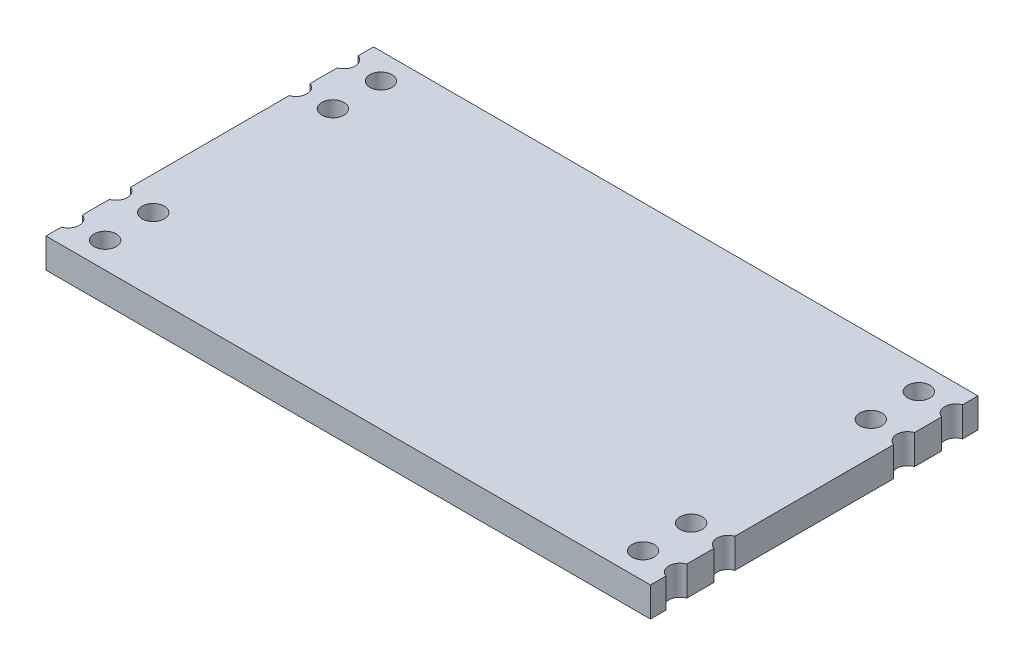
ISO-10303-21;
HEADER;
FILE_DESCRIPTION(('STEP AP214'),'2;1');
FILE_NAME('part.step','',(''),(''),'','','');
FILE_SCHEMA(('AUTOMOTIVE_DESIGN { 1 0 10303 214 1 1 1 1 }'));
ENDSEC;
DATA;
#1=APPLICATION_CONTEXT('core data for automotive mechanical design processes');
#2=APPLICATION_PROTOCOL_DEFINITION('international standard','automotive_design',2000,#1);
#3=PRODUCT_CONTEXT('',#1,'mechanical');
#4=PRODUCT('Part','Part','',(#3));
#5=PRODUCT_RELATED_PRODUCT_CATEGORY('part','',(#4));
#6=PRODUCT_DEFINITION_FORMATION('','',#4);
#7=PRODUCT_DEFINITION_CONTEXT('part definition',#1,'design');
#8=PRODUCT_DEFINITION('design','',#6,#7);
#9=PRODUCT_DEFINITION_SHAPE('','',#8);
#10=(LENGTH_UNIT() NAMED_UNIT(*) SI_UNIT(.MILLI.,.METRE.));
#11=(NAMED_UNIT(*) PLANE_ANGLE_UNIT() SI_UNIT($,.RADIAN.));
#12=(NAMED_UNIT(*) SI_UNIT($,.STERADIAN.) SOLID_ANGLE_UNIT());
#13=UNCERTAINTY_MEASURE_WITH_UNIT(LENGTH_MEASURE(1.E-05),#10,'distance_accuracy_value','');
#14=(GEOMETRIC_REPRESENTATION_CONTEXT(3) GLOBAL_UNCERTAINTY_ASSIGNED_CONTEXT((#13)) GLOBAL_UNIT_ASSIGNED_CONTEXT((#10,
#11,#12)) REPRESENTATION_CONTEXT('',''));
#15=CARTESIAN_POINT('',(0.,0.,0.));
#16=DIRECTION('',(0.,0.,1.));
#17=DIRECTION('',(1.,0.,0.));
#18=AXIS2_PLACEMENT_3D('',#15,#16,#17);
#19=CARTESIAN_POINT('',(16.35,1.6,-8.86));
#20=DIRECTION('',(-1.,0.,0.));
#21=DIRECTION('',(0.,0.,1.));
#22=AXIS2_PLACEMENT_3D('',#19,#20,#21);
#23=PLANE('',#22);
#24=DIRECTION('',(0.,0.,-1.));
#25=VECTOR('',#24,1.);
#26=CARTESIAN_POINT('',(16.35,0.,-8.86));
#27=LINE('',#26,#25);
#28=CARTESIAN_POINT('',(16.35,0.,8.86));
#29=VERTEX_POINT('',#28);
#30=CARTESIAN_POINT('',(16.35,0.,8.02568542494924));
#31=VERTEX_POINT('',#30);
#32=EDGE_CURVE('E206',#29,#31,#27,.T.);
#33=ORIENTED_EDGE('',*,*,#32,.T.);
#34=DIRECTION('',(0.,1.,0.));
#35=VECTOR('',#34,1.);
#36=CARTESIAN_POINT('',(16.35,0.,8.02568542494924));
#37=LINE('',#36,#35);
#38=CARTESIAN_POINT('',(16.35,1.6,8.02568542494924));
#39=VERTEX_POINT('',#38);
#40=EDGE_CURVE('E66',#31,#39,#37,.T.);
#41=ORIENTED_EDGE('',*,*,#40,.T.);
#42=DIRECTION('',(0.,0.,-1.));
#43=VECTOR('',#42,1.);
#44=CARTESIAN_POINT('',(16.35,1.6,-8.86));
#45=LINE('',#44,#43);
#46=CARTESIAN_POINT('',(16.35,1.6,8.86));
#47=VERTEX_POINT('',#46);
#48=EDGE_CURVE('E285',#47,#39,#45,.T.);
#49=ORIENTED_EDGE('',*,*,#48,.F.);
#50=DIRECTION('',(0.,-1.,0.));
#51=VECTOR('',#50,1.);
#52=CARTESIAN_POINT('',(16.35,1.6,8.86));
#53=LINE('',#52,#51);
#54=EDGE_CURVE('E230',#47,#29,#53,.T.);
#55=ORIENTED_EDGE('',*,*,#54,.T.);
#56=EDGE_LOOP('',(#33,#41,#49,#55));
#57=FACE_BOUND('',#56,.T.);
#58=ADVANCED_FACE('F43',(#57),#23,.F.);
#59=CARTESIAN_POINT('',(16.35,1.6,6.89431457505077));
#60=VERTEX_POINT('',#59);
#61=CARTESIAN_POINT('',(16.35,1.6,5.42568542494924));
#62=VERTEX_POINT('',#61);
#63=EDGE_CURVE('E289',#60,#62,#45,.T.);
#64=ORIENTED_EDGE('',*,*,#63,.F.);
#65=DIRECTION('',(0.,1.,0.));
#66=VECTOR('',#65,1.);
#67=CARTESIAN_POINT('',(16.35,0.,6.89431457505077));
#68=LINE('',#67,#66);
#69=CARTESIAN_POINT('',(16.35,0.,6.89431457505077));
#70=VERTEX_POINT('',#69);
#71=EDGE_CURVE('E308',#60,#70,#68,.F.);
#72=ORIENTED_EDGE('',*,*,#71,.T.);
#73=CARTESIAN_POINT('',(16.35,0.,5.42568542494924));
#74=VERTEX_POINT('',#73);
#75=EDGE_CURVE('E203',#70,#74,#27,.T.);
#76=ORIENTED_EDGE('',*,*,#75,.T.);
#77=DIRECTION('',(0.,1.,0.));
#78=VECTOR('',#77,1.);
#79=CARTESIAN_POINT('',(16.35,0.,5.42568542494924));
#80=LINE('',#79,#78);
#81=EDGE_CURVE('E58',#74,#62,#80,.T.);
#82=ORIENTED_EDGE('',*,*,#81,.T.);
#83=EDGE_LOOP('',(#64,#72,#76,#82));
#84=FACE_BOUND('',#83,.T.);
#85=ADVANCED_FACE('F400',(#84),#23,.F.);
#86=CARTESIAN_POINT('',(-16.35,1.6,-8.86));
#87=DIRECTION('',(1.,0.,0.));
#88=DIRECTION('',(0.,0.,-1.));
#89=AXIS2_PLACEMENT_3D('',#86,#87,#88);
#90=PLANE('',#89);
#91=DIRECTION('',(0.,1.,0.));
#92=VECTOR('',#91,1.);
#93=CARTESIAN_POINT('',(-16.35,0.,6.89431457505077));
#94=LINE('',#93,#92);
#95=CARTESIAN_POINT('',(-16.35,1.6,6.89431457505077));
#96=VERTEX_POINT('',#95);
#97=CARTESIAN_POINT('',(-16.35,0.,6.89431457505077));
#98=VERTEX_POINT('',#97);
#99=EDGE_CURVE('E340',#96,#98,#94,.F.);
#100=ORIENTED_EDGE('',*,*,#99,.F.);
#101=DIRECTION('',(0.,0.,1.));
#102=VECTOR('',#101,1.);
#103=CARTESIAN_POINT('',(-16.35,1.6,-8.86));
#104=LINE('',#103,#102);
#105=CARTESIAN_POINT('',(-16.35,1.6,5.42568542494924));
#106=VERTEX_POINT('',#105);
#107=EDGE_CURVE('E479',#106,#96,#104,.T.);
#108=ORIENTED_EDGE('',*,*,#107,.F.);
#109=DIRECTION('',(0.,1.,0.));
#110=VECTOR('',#109,1.);
#111=CARTESIAN_POINT('',(-16.35,0.,5.42568542494924));
#112=LINE('',#111,#110);
#113=CARTESIAN_POINT('',(-16.35,0.,5.42568542494924));
#114=VERTEX_POINT('',#113);
#115=EDGE_CURVE('E328',#114,#106,#112,.T.);
#116=ORIENTED_EDGE('',*,*,#115,.F.);
#117=DIRECTION('',(0.,0.,1.));
#118=VECTOR('',#117,1.);
#119=CARTESIAN_POINT('',(-16.35,0.,-8.86));
#120=LINE('',#119,#118);
#121=EDGE_CURVE('E221',#114,#98,#120,.T.);
#122=ORIENTED_EDGE('',*,*,#121,.T.);
#123=EDGE_LOOP('',(#100,#108,#116,#122));
#124=FACE_BOUND('',#123,.T.);
#125=ADVANCED_FACE('F405',(#124),#90,.F.);
#126=DIRECTION('',(0.,1.,0.));
#127=VECTOR('',#126,1.);
#128=CARTESIAN_POINT('',(-16.35,0.,8.02568542494924));
#129=LINE('',#128,#127);
#130=CARTESIAN_POINT('',(-16.35,0.,8.02568542494924));
#131=VERTEX_POINT('',#130);
#132=CARTESIAN_POINT('',(-16.35,1.6,8.02568542494924));
#133=VERTEX_POINT('',#132);
#134=EDGE_CURVE('E338',#131,#133,#129,.T.);
#135=ORIENTED_EDGE('',*,*,#134,.F.);
#136=CARTESIAN_POINT('',(-16.35,0.,8.86));
#137=VERTEX_POINT('',#136);
#138=EDGE_CURVE('E216',#131,#137,#120,.T.);
#139=ORIENTED_EDGE('',*,*,#138,.T.);
#140=DIRECTION('',(0.,-1.,0.));
#141=VECTOR('',#140,1.);
#142=CARTESIAN_POINT('',(-16.35,1.6,8.86));
#143=LINE('',#142,#141);
#144=CARTESIAN_POINT('',(-16.35,1.6,8.86));
#145=VERTEX_POINT('',#144);
#146=EDGE_CURVE('E232',#145,#137,#143,.T.);
#147=ORIENTED_EDGE('',*,*,#146,.F.);
#148=EDGE_CURVE('E292',#133,#145,#104,.T.);
#149=ORIENTED_EDGE('',*,*,#148,.F.);
#150=EDGE_LOOP('',(#135,#139,#147,#149));
#151=FACE_BOUND('',#150,.T.);
#152=ADVANCED_FACE('F415',(#151),#90,.F.);
#153=DIRECTION('',(0.,1.,0.));
#154=VECTOR('',#153,1.);
#155=CARTESIAN_POINT('',(-16.35,0.,4.29431457505077));
#156=LINE('',#155,#154);
#157=CARTESIAN_POINT('',(-16.35,1.6,4.29431457505077));
#158=VERTEX_POINT('',#157);
#159=CARTESIAN_POINT('',(-16.35,0.,4.29431457505077));
#160=VERTEX_POINT('',#159);
#161=EDGE_CURVE('E336',#158,#160,#156,.F.);
#162=ORIENTED_EDGE('',*,*,#161,.F.);
#163=CARTESIAN_POINT('',(-16.35,1.6,-4.29431457505076));
#164=VERTEX_POINT('',#163);
#165=EDGE_CURVE('E465',#164,#158,#104,.T.);
#166=ORIENTED_EDGE('',*,*,#165,.F.);
#167=DIRECTION('',(0.,1.,0.));
#168=VECTOR('',#167,1.);
#169=CARTESIAN_POINT('',(-16.35,0.,-4.29431457505076));
#170=LINE('',#169,#168);
#171=CARTESIAN_POINT('',(-16.35,0.,-4.29431457505076));
#172=VERTEX_POINT('',#171);
#173=EDGE_CURVE('E251',#164,#172,#170,.F.);
#174=ORIENTED_EDGE('',*,*,#173,.T.);
#175=EDGE_CURVE('E463',#172,#160,#120,.T.);
#176=ORIENTED_EDGE('',*,*,#175,.T.);
#177=EDGE_LOOP('',(#162,#166,#174,#176));
#178=FACE_BOUND('',#177,.T.);
#179=ADVANCED_FACE('F409',(#178),#90,.F.);
#180=DIRECTION('',(0.,1.,0.));
#181=VECTOR('',#180,1.);
#182=CARTESIAN_POINT('',(16.35,0.,-6.89431457505077));
#183=LINE('',#182,#181);
#184=CARTESIAN_POINT('',(16.35,1.6,-6.89431457505077));
#185=VERTEX_POINT('',#184);
#186=CARTESIAN_POINT('',(16.35,0.,-6.89431457505077));
#187=VERTEX_POINT('',#186);
#188=EDGE_CURVE('E369',#185,#187,#183,.F.);
#189=ORIENTED_EDGE('',*,*,#188,.F.);
#190=CARTESIAN_POINT('',(16.35,1.6,-5.42568542494924));
#191=VERTEX_POINT('',#190);
#192=EDGE_CURVE('E290',#191,#185,#45,.T.);
#193=ORIENTED_EDGE('',*,*,#192,.F.);
#194=DIRECTION('',(0.,1.,0.));
#195=VECTOR('',#194,1.);
#196=CARTESIAN_POINT('',(16.35,0.,-5.42568542494924));
#197=LINE('',#196,#195);
#198=CARTESIAN_POINT('',(16.35,0.,-5.42568542494924));
#199=VERTEX_POINT('',#198);
#200=EDGE_CURVE('E357',#199,#191,#197,.T.);
#201=ORIENTED_EDGE('',*,*,#200,.F.);
#202=EDGE_CURVE('E204',#199,#187,#27,.T.);
#203=ORIENTED_EDGE('',*,*,#202,.T.);
#204=EDGE_LOOP('',(#189,#193,#201,#203));
#205=FACE_BOUND('',#204,.T.);
#206=ADVANCED_FACE('F45',(#205),#23,.F.);
#207=DIRECTION('',(0.,1.,0.));
#208=VECTOR('',#207,1.);
#209=CARTESIAN_POINT('',(16.35,0.,-8.02568542494924));
#210=LINE('',#209,#208);
#211=CARTESIAN_POINT('',(16.35,0.,-8.02568542494924));
#212=VERTEX_POINT('',#211);
#213=CARTESIAN_POINT('',(16.35,1.6,-8.02568542494924));
#214=VERTEX_POINT('',#213);
#215=EDGE_CURVE('E367',#212,#214,#210,.T.);
#216=ORIENTED_EDGE('',*,*,#215,.F.);
#217=CARTESIAN_POINT('',(16.35,0.,-8.86));
#218=VERTEX_POINT('',#217);
#219=EDGE_CURVE('E207',#212,#218,#27,.T.);
#220=ORIENTED_EDGE('',*,*,#219,.T.);
#221=DIRECTION('',(0.,-1.,0.));
#222=VECTOR('',#221,1.);
#223=CARTESIAN_POINT('',(16.35,1.6,-8.86));
#224=LINE('',#223,#222);
#225=CARTESIAN_POINT('',(16.35,1.6,-8.86));
#226=VERTEX_POINT('',#225);
#227=EDGE_CURVE('E11',#226,#218,#224,.T.);
#228=ORIENTED_EDGE('',*,*,#227,.F.);
#229=EDGE_CURVE('E229',#214,#226,#45,.T.);
#230=ORIENTED_EDGE('',*,*,#229,.F.);
#231=EDGE_LOOP('',(#216,#220,#228,#230));
#232=FACE_BOUND('',#231,.T.);
#233=ADVANCED_FACE('F407',(#232),#23,.F.);
#234=CARTESIAN_POINT('',(16.35,1.6,4.29431457505077));
#235=VERTEX_POINT('',#234);
#236=CARTESIAN_POINT('',(16.35,1.6,-4.29431457505077));
#237=VERTEX_POINT('',#236);
#238=EDGE_CURVE('E195',#235,#237,#45,.T.);
#239=ORIENTED_EDGE('',*,*,#238,.F.);
#240=DIRECTION('',(0.,1.,0.));
#241=VECTOR('',#240,1.);
#242=CARTESIAN_POINT('',(16.35,0.,4.29431457505077));
#243=LINE('',#242,#241);
#244=CARTESIAN_POINT('',(16.35,0.,4.29431457505077));
#245=VERTEX_POINT('',#244);
#246=EDGE_CURVE('E180',#235,#245,#243,.F.);
#247=ORIENTED_EDGE('',*,*,#246,.T.);
#248=CARTESIAN_POINT('',(16.35,0.,-4.29431457505077));
#249=VERTEX_POINT('',#248);
#250=EDGE_CURVE('E193',#245,#249,#27,.T.);
#251=ORIENTED_EDGE('',*,*,#250,.T.);
#252=DIRECTION('',(0.,1.,0.));
#253=VECTOR('',#252,1.);
#254=CARTESIAN_POINT('',(16.35,0.,-4.29431457505077));
#255=LINE('',#254,#253);
#256=EDGE_CURVE('E365',#237,#249,#255,.F.);
#257=ORIENTED_EDGE('',*,*,#256,.F.);
#258=EDGE_LOOP('',(#239,#247,#251,#257));
#259=FACE_BOUND('',#258,.T.);
#260=ADVANCED_FACE('F191',(#259),#23,.F.);
#261=CARTESIAN_POINT('',(-16.35,0.,-8.86));
#262=VERTEX_POINT('',#261);
#263=CARTESIAN_POINT('',(-16.35,0.,-8.02568542494924));
#264=VERTEX_POINT('',#263);
#265=EDGE_CURVE('E223',#262,#264,#120,.T.);
#266=ORIENTED_EDGE('',*,*,#265,.T.);
#267=DIRECTION('',(0.,1.,0.));
#268=VECTOR('',#267,1.);
#269=CARTESIAN_POINT('',(-16.35,0.,-8.02568542494924));
#270=LINE('',#269,#268);
#271=CARTESIAN_POINT('',(-16.35,1.6,-8.02568542494924));
#272=VERTEX_POINT('',#271);
#273=EDGE_CURVE('E271',#264,#272,#270,.T.);
#274=ORIENTED_EDGE('',*,*,#273,.T.);
#275=CARTESIAN_POINT('',(-16.35,1.6,-8.86));
#276=VERTEX_POINT('',#275);
#277=EDGE_CURVE('E241',#276,#272,#104,.T.);
#278=ORIENTED_EDGE('',*,*,#277,.F.);
#279=DIRECTION('',(0.,-1.,0.));
#280=VECTOR('',#279,1.);
#281=CARTESIAN_POINT('',(-16.35,1.6,-8.86));
#282=LINE('',#281,#280);
#283=EDGE_CURVE('E51',#276,#262,#282,.T.);
#284=ORIENTED_EDGE('',*,*,#283,.T.);
#285=EDGE_LOOP('',(#266,#274,#278,#284));
#286=FACE_BOUND('',#285,.T.);
#287=ADVANCED_FACE('F238',(#286),#90,.F.);
#288=CARTESIAN_POINT('',(-16.35,1.6,-6.89431457505076));
#289=VERTEX_POINT('',#288);
#290=CARTESIAN_POINT('',(-16.35,1.6,-5.42568542494924));
#291=VERTEX_POINT('',#290);
#292=EDGE_CURVE('E293',#289,#291,#104,.T.);
#293=ORIENTED_EDGE('',*,*,#292,.F.);
#294=DIRECTION('',(0.,1.,0.));
#295=VECTOR('',#294,1.);
#296=CARTESIAN_POINT('',(-16.35,0.,-6.89431457505076));
#297=LINE('',#296,#295);
#298=CARTESIAN_POINT('',(-16.35,0.,-6.89431457505076));
#299=VERTEX_POINT('',#298);
#300=EDGE_CURVE('E269',#289,#299,#297,.F.);
#301=ORIENTED_EDGE('',*,*,#300,.T.);
#302=CARTESIAN_POINT('',(-16.35,0.,-5.42568542494924));
#303=VERTEX_POINT('',#302);
#304=EDGE_CURVE('E227',#299,#303,#120,.T.);
#305=ORIENTED_EDGE('',*,*,#304,.T.);
#306=DIRECTION('',(0.,1.,0.));
#307=VECTOR('',#306,1.);
#308=CARTESIAN_POINT('',(-16.35,0.,-5.42568542494924));
#309=LINE('',#308,#307);
#310=EDGE_CURVE('E255',#303,#291,#309,.T.);
#311=ORIENTED_EDGE('',*,*,#310,.T.);
#312=EDGE_LOOP('',(#293,#301,#305,#311));
#313=FACE_BOUND('',#312,.T.);
#314=ADVANCED_FACE('F424',(#313),#90,.F.);
#315=CARTESIAN_POINT('',(-16.35,1.6,-8.86));
#316=DIRECTION('',(0.,0.,1.));
#317=DIRECTION('',(1.,0.,0.));
#318=AXIS2_PLACEMENT_3D('',#315,#316,#317);
#319=PLANE('',#318);
#320=DIRECTION('',(-1.,0.,0.));
#321=VECTOR('',#320,1.);
#322=CARTESIAN_POINT('',(-16.35,0.,-8.86));
#323=LINE('',#322,#321);
#324=EDGE_CURVE('E212',#218,#262,#323,.T.);
#325=ORIENTED_EDGE('',*,*,#324,.T.);
#326=ORIENTED_EDGE('',*,*,#283,.F.);
#327=DIRECTION('',(-1.,0.,0.));
#328=VECTOR('',#327,1.);
#329=CARTESIAN_POINT('',(-16.35,1.6,-8.86));
#330=LINE('',#329,#328);
#331=EDGE_CURVE('E288',#226,#276,#330,.T.);
#332=ORIENTED_EDGE('',*,*,#331,.F.);
#333=ORIENTED_EDGE('',*,*,#227,.T.);
#334=EDGE_LOOP('',(#325,#326,#332,#333));
#335=FACE_BOUND('',#334,.T.);
#336=ADVANCED_FACE('F429',(#335),#319,.F.);
#337=CARTESIAN_POINT('',(-16.35,1.6,8.86));
#338=DIRECTION('',(0.,0.,-1.));
#339=DIRECTION('',(-1.,0.,0.));
#340=AXIS2_PLACEMENT_3D('',#337,#338,#339);
#341=PLANE('',#340);
#342=DIRECTION('',(1.,0.,0.));
#343=VECTOR('',#342,1.);
#344=CARTESIAN_POINT('',(-16.35,0.,8.86));
#345=LINE('',#344,#343);
#346=EDGE_CURVE('E226',#137,#29,#345,.T.);
#347=ORIENTED_EDGE('',*,*,#346,.T.);
#348=ORIENTED_EDGE('',*,*,#54,.F.);
#349=DIRECTION('',(1.,0.,0.));
#350=VECTOR('',#349,1.);
#351=CARTESIAN_POINT('',(-16.35,1.6,8.86));
#352=LINE('',#351,#350);
#353=EDGE_CURVE('E233',#145,#47,#352,.T.);
#354=ORIENTED_EDGE('',*,*,#353,.F.);
#355=ORIENTED_EDGE('',*,*,#146,.T.);
#356=EDGE_LOOP('',(#347,#348,#354,#355));
#357=FACE_BOUND('',#356,.T.);
#358=ADVANCED_FACE('F305',(#357),#341,.F.);
#359=CARTESIAN_POINT('',(0.,1.6,0.));
#360=DIRECTION('',(0.,1.,0.));
#361=DIRECTION('',(0.,0.,1.));
#362=AXIS2_PLACEMENT_3D('',#359,#360,#361);
#363=PLANE('',#362);
#364=CARTESIAN_POINT('',(16.55,1.6,7.46));
#365=DIRECTION('',(0.,1.,0.));
#366=DIRECTION('',(0.,0.,-1.));
#367=AXIS2_PLACEMENT_3D('',#364,#365,#366);
#368=CIRCLE('',#367,0.6);
#369=EDGE_CURVE('E186',#60,#39,#368,.T.);
#370=ORIENTED_EDGE('',*,*,#369,.F.);
#371=ORIENTED_EDGE('',*,*,#63,.T.);
#372=CARTESIAN_POINT('',(16.55,1.6,4.86));
#373=DIRECTION('',(0.,1.,0.));
#374=DIRECTION('',(0.,0.,-1.));
#375=AXIS2_PLACEMENT_3D('',#372,#373,#374);
#376=CIRCLE('',#375,0.6);
#377=EDGE_CURVE('E187',#235,#62,#376,.T.);
#378=ORIENTED_EDGE('',*,*,#377,.F.);
#379=ORIENTED_EDGE('',*,*,#238,.T.);
#380=CARTESIAN_POINT('',(16.55,1.6,-4.86));
#381=DIRECTION('',(0.,-1.,0.));
#382=DIRECTION('',(0.,0.,1.));
#383=AXIS2_PLACEMENT_3D('',#380,#381,#382);
#384=CIRCLE('',#383,0.6);
#385=EDGE_CURVE('E346',#237,#191,#384,.T.);
#386=ORIENTED_EDGE('',*,*,#385,.T.);
#387=ORIENTED_EDGE('',*,*,#192,.T.);
#388=CARTESIAN_POINT('',(16.55,1.6,-7.46));
#389=DIRECTION('',(0.,-1.,0.));
#390=DIRECTION('',(0.,0.,1.));
#391=AXIS2_PLACEMENT_3D('',#388,#389,#390);
#392=CIRCLE('',#391,0.6);
#393=EDGE_CURVE('E358',#185,#214,#392,.T.);
#394=ORIENTED_EDGE('',*,*,#393,.T.);
#395=ORIENTED_EDGE('',*,*,#229,.T.);
#396=ORIENTED_EDGE('',*,*,#331,.T.);
#397=ORIENTED_EDGE('',*,*,#277,.T.);
#398=CARTESIAN_POINT('',(-16.55,1.6,-7.46));
#399=DIRECTION('',(0.,1.,0.));
#400=DIRECTION('',(0.,0.,1.));
#401=AXIS2_PLACEMENT_3D('',#398,#399,#400);
#402=CIRCLE('',#401,0.6);
#403=EDGE_CURVE('E252',#289,#272,#402,.T.);
#404=ORIENTED_EDGE('',*,*,#403,.F.);
#405=ORIENTED_EDGE('',*,*,#292,.T.);
#406=CARTESIAN_POINT('',(-16.55,1.6,-4.86));
#407=DIRECTION('',(0.,1.,0.));
#408=DIRECTION('',(0.,0.,1.));
#409=AXIS2_PLACEMENT_3D('',#406,#407,#408);
#410=CIRCLE('',#409,0.6);
#411=EDGE_CURVE('E264',#164,#291,#410,.T.);
#412=ORIENTED_EDGE('',*,*,#411,.F.);
#413=ORIENTED_EDGE('',*,*,#165,.T.);
#414=CARTESIAN_POINT('',(-16.55,1.6,4.86));
#415=DIRECTION('',(0.,-1.,0.));
#416=DIRECTION('',(0.,0.,-1.));
#417=AXIS2_PLACEMENT_3D('',#414,#415,#416);
#418=CIRCLE('',#417,0.6);
#419=EDGE_CURVE('E320',#158,#106,#418,.T.);
#420=ORIENTED_EDGE('',*,*,#419,.T.);
#421=ORIENTED_EDGE('',*,*,#107,.T.);
#422=CARTESIAN_POINT('',(-16.55,1.6,7.46));
#423=DIRECTION('',(0.,-1.,0.));
#424=DIRECTION('',(0.,0.,-1.));
#425=AXIS2_PLACEMENT_3D('',#422,#423,#424);
#426=CIRCLE('',#425,0.6);
#427=EDGE_CURVE('E329',#96,#133,#426,.T.);
#428=ORIENTED_EDGE('',*,*,#427,.T.);
#429=ORIENTED_EDGE('',*,*,#148,.T.);
#430=ORIENTED_EDGE('',*,*,#353,.T.);
#431=ORIENTED_EDGE('',*,*,#48,.T.);
#432=EDGE_LOOP('',(#370,#371,#378,#379,#386,#387,#394,#395,#396,#397,#404,#405,#412,#413,#420,
#421,#428,#429,#430,#431));
#433=FACE_BOUND('',#432,.T.);
#434=CARTESIAN_POINT('',(14.55,1.6,7.46));
#435=DIRECTION('',(0.,1.,0.));
#436=DIRECTION('',(0.,0.,-1.));
#437=AXIS2_PLACEMENT_3D('',#434,#435,#436);
#438=CIRCLE('',#437,0.6);
#439=CARTESIAN_POINT('',(14.55,1.6,6.86));
#440=VERTEX_POINT('',#439);
#441=EDGE_CURVE('E321',#440,#440,#438,.T.);
#442=ORIENTED_EDGE('',*,*,#441,.F.);
#443=EDGE_LOOP('',(#442));
#444=FACE_BOUND('',#443,.T.);
#445=CARTESIAN_POINT('',(14.55,1.6,4.86));
#446=DIRECTION('',(0.,1.,0.));
#447=DIRECTION('',(0.,0.,-1.));
#448=AXIS2_PLACEMENT_3D('',#445,#446,#447);
#449=CIRCLE('',#448,0.6);
#450=CARTESIAN_POINT('',(14.55,1.6,4.26));
#451=VERTEX_POINT('',#450);
#452=EDGE_CURVE('E307',#451,#451,#449,.T.);
#453=ORIENTED_EDGE('',*,*,#452,.F.);
#454=EDGE_LOOP('',(#453));
#455=FACE_BOUND('',#454,.T.);
#456=CARTESIAN_POINT('',(-14.55,1.6,7.46));
#457=DIRECTION('',(0.,-1.,0.));
#458=DIRECTION('',(0.,0.,-1.));
#459=AXIS2_PLACEMENT_3D('',#456,#457,#458);
#460=CIRCLE('',#459,0.6);
#461=CARTESIAN_POINT('',(-14.55,1.6,6.86));
#462=VERTEX_POINT('',#461);
#463=EDGE_CURVE('E347',#462,#462,#460,.T.);
#464=ORIENTED_EDGE('',*,*,#463,.T.);
#465=EDGE_LOOP('',(#464));
#466=FACE_BOUND('',#465,.T.);
#467=CARTESIAN_POINT('',(-14.55,1.6,4.86));
#468=DIRECTION('',(0.,-1.,0.));
#469=DIRECTION('',(0.,0.,-1.));
#470=AXIS2_PLACEMENT_3D('',#467,#468,#469);
#471=CIRCLE('',#470,0.6);
#472=CARTESIAN_POINT('',(-14.55,1.6,4.26));
#473=VERTEX_POINT('',#472);
#474=EDGE_CURVE('E342',#473,#473,#471,.T.);
#475=ORIENTED_EDGE('',*,*,#474,.T.);
#476=EDGE_LOOP('',(#475));
#477=FACE_BOUND('',#476,.T.);
#478=CARTESIAN_POINT('',(14.55,1.6,-7.46));
#479=DIRECTION('',(0.,-1.,0.));
#480=DIRECTION('',(0.,0.,1.));
#481=AXIS2_PLACEMENT_3D('',#478,#479,#480);
#482=CIRCLE('',#481,0.6);
#483=CARTESIAN_POINT('',(14.55,1.6,-6.86));
#484=VERTEX_POINT('',#483);
#485=EDGE_CURVE('E373',#484,#484,#482,.T.);
#486=ORIENTED_EDGE('',*,*,#485,.T.);
#487=EDGE_LOOP('',(#486));
#488=FACE_BOUND('',#487,.T.);
#489=CARTESIAN_POINT('',(14.55,1.6,-4.86));
#490=DIRECTION('',(0.,-1.,0.));
#491=DIRECTION('',(0.,0.,1.));
#492=AXIS2_PLACEMENT_3D('',#489,#490,#491);
#493=CIRCLE('',#492,0.6);
#494=CARTESIAN_POINT('',(14.55,1.6,-4.26));
#495=VERTEX_POINT('',#494);
#496=EDGE_CURVE('E260',#495,#495,#493,.T.);
#497=ORIENTED_EDGE('',*,*,#496,.T.);
#498=EDGE_LOOP('',(#497));
#499=FACE_BOUND('',#498,.T.);
#500=CARTESIAN_POINT('',(-14.55,1.6,-7.46));
#501=DIRECTION('',(0.,1.,0.));
#502=DIRECTION('',(0.,0.,1.));
#503=AXIS2_PLACEMENT_3D('',#500,#501,#502);
#504=CIRCLE('',#503,0.6);
#505=CARTESIAN_POINT('',(-14.55,1.6,-6.86));
#506=VERTEX_POINT('',#505);
#507=EDGE_CURVE('E277',#506,#506,#504,.T.);
#508=ORIENTED_EDGE('',*,*,#507,.F.);
#509=EDGE_LOOP('',(#508));
#510=FACE_BOUND('',#509,.T.);
#511=CARTESIAN_POINT('',(-14.55,1.6,-4.86));
#512=DIRECTION('',(0.,1.,0.));
#513=DIRECTION('',(0.,0.,1.));
#514=AXIS2_PLACEMENT_3D('',#511,#512,#513);
#515=CIRCLE('',#514,0.6);
#516=CARTESIAN_POINT('',(-14.55,1.6,-4.26));
#517=VERTEX_POINT('',#516);
#518=EDGE_CURVE('E273',#517,#517,#515,.T.);
#519=ORIENTED_EDGE('',*,*,#518,.F.);
#520=EDGE_LOOP('',(#519));
#521=FACE_BOUND('',#520,.T.);
#522=ADVANCED_FACE('F298',(#433,#444,#455,#466,#477,#488,#499,#510,#521),#363,.T.);
#523=CARTESIAN_POINT('',(0.,0.,0.));
#524=DIRECTION('',(0.,1.,0.));
#525=DIRECTION('',(0.,0.,1.));
#526=AXIS2_PLACEMENT_3D('',#523,#524,#525);
#527=PLANE('',#526);
#528=CARTESIAN_POINT('',(14.55,0.,7.46));
#529=DIRECTION('',(0.,1.,0.));
#530=DIRECTION('',(0.,0.,-1.));
#531=AXIS2_PLACEMENT_3D('',#528,#529,#530);
#532=CIRCLE('',#531,0.6);
#533=CARTESIAN_POINT('',(14.55,0.,6.86));
#534=VERTEX_POINT('',#533);
#535=EDGE_CURVE('E317',#534,#534,#532,.T.);
#536=ORIENTED_EDGE('',*,*,#535,.T.);
#537=EDGE_LOOP('',(#536));
#538=FACE_BOUND('',#537,.T.);
#539=CARTESIAN_POINT('',(14.55,0.,4.86));
#540=DIRECTION('',(0.,1.,0.));
#541=DIRECTION('',(0.,0.,-1.));
#542=AXIS2_PLACEMENT_3D('',#539,#540,#541);
#543=CIRCLE('',#542,0.6);
#544=CARTESIAN_POINT('',(14.55,0.,4.26));
#545=VERTEX_POINT('',#544);
#546=EDGE_CURVE('E311',#545,#545,#543,.T.);
#547=ORIENTED_EDGE('',*,*,#546,.T.);
#548=EDGE_LOOP('',(#547));
#549=FACE_BOUND('',#548,.T.);
#550=ORIENTED_EDGE('',*,*,#75,.F.);
#551=CARTESIAN_POINT('',(16.55,0.,7.46));
#552=DIRECTION('',(0.,1.,0.));
#553=DIRECTION('',(0.,0.,-1.));
#554=AXIS2_PLACEMENT_3D('',#551,#552,#553);
#555=CIRCLE('',#554,0.6);
#556=EDGE_CURVE('E196',#70,#31,#555,.T.);
#557=ORIENTED_EDGE('',*,*,#556,.T.);
#558=ORIENTED_EDGE('',*,*,#32,.F.);
#559=ORIENTED_EDGE('',*,*,#346,.F.);
#560=ORIENTED_EDGE('',*,*,#138,.F.);
#561=CARTESIAN_POINT('',(-16.55,0.,7.46));
#562=DIRECTION('',(0.,-1.,0.));
#563=DIRECTION('',(0.,0.,-1.));
#564=AXIS2_PLACEMENT_3D('',#561,#562,#563);
#565=CIRCLE('',#564,0.6);
#566=EDGE_CURVE('E326',#98,#131,#565,.T.);
#567=ORIENTED_EDGE('',*,*,#566,.F.);
#568=ORIENTED_EDGE('',*,*,#121,.F.);
#569=CARTESIAN_POINT('',(-16.55,0.,4.86));
#570=DIRECTION('',(0.,-1.,0.));
#571=DIRECTION('',(0.,0.,-1.));
#572=AXIS2_PLACEMENT_3D('',#569,#570,#571);
#573=CIRCLE('',#572,0.6);
#574=EDGE_CURVE('E331',#160,#114,#573,.T.);
#575=ORIENTED_EDGE('',*,*,#574,.F.);
#576=ORIENTED_EDGE('',*,*,#175,.F.);
#577=CARTESIAN_POINT('',(-16.55,0.,-4.86));
#578=DIRECTION('',(0.,1.,0.));
#579=DIRECTION('',(0.,0.,1.));
#580=AXIS2_PLACEMENT_3D('',#577,#578,#579);
#581=CIRCLE('',#580,0.6);
#582=EDGE_CURVE('E257',#172,#303,#581,.T.);
#583=ORIENTED_EDGE('',*,*,#582,.T.);
#584=ORIENTED_EDGE('',*,*,#304,.F.);
#585=CARTESIAN_POINT('',(-16.55,0.,-7.46));
#586=DIRECTION('',(0.,1.,0.));
#587=DIRECTION('',(0.,0.,1.));
#588=AXIS2_PLACEMENT_3D('',#585,#586,#587);
#589=CIRCLE('',#588,0.6);
#590=EDGE_CURVE('E246',#299,#264,#589,.T.);
#591=ORIENTED_EDGE('',*,*,#590,.T.);
#592=ORIENTED_EDGE('',*,*,#265,.F.);
#593=ORIENTED_EDGE('',*,*,#324,.F.);
#594=ORIENTED_EDGE('',*,*,#219,.F.);
#595=CARTESIAN_POINT('',(16.55,0.,-7.46));
#596=DIRECTION('',(0.,-1.,0.));
#597=DIRECTION('',(0.,0.,1.));
#598=AXIS2_PLACEMENT_3D('',#595,#596,#597);
#599=CIRCLE('',#598,0.6);
#600=EDGE_CURVE('E355',#187,#212,#599,.T.);
#601=ORIENTED_EDGE('',*,*,#600,.F.);
#602=ORIENTED_EDGE('',*,*,#202,.F.);
#603=CARTESIAN_POINT('',(16.55,0.,-4.86));
#604=DIRECTION('',(0.,-1.,0.));
#605=DIRECTION('',(0.,0.,1.));
#606=AXIS2_PLACEMENT_3D('',#603,#604,#605);
#607=CIRCLE('',#606,0.6);
#608=EDGE_CURVE('E202',#249,#199,#607,.T.);
#609=ORIENTED_EDGE('',*,*,#608,.F.);
#610=ORIENTED_EDGE('',*,*,#250,.F.);
#611=CARTESIAN_POINT('',(16.55,0.,4.86));
#612=DIRECTION('',(0.,1.,0.));
#613=DIRECTION('',(0.,0.,-1.));
#614=AXIS2_PLACEMENT_3D('',#611,#612,#613);
#615=CIRCLE('',#614,0.6);
#616=EDGE_CURVE('E177',#245,#74,#615,.T.);
#617=ORIENTED_EDGE('',*,*,#616,.T.);
#618=EDGE_LOOP('',(#550,#557,#558,#559,#560,#567,#568,#575,#576,#583,#584,#591,#592,#593,#594,
#601,#602,#609,#610,#617));
#619=FACE_BOUND('',#618,.T.);
#620=CARTESIAN_POINT('',(-14.55,0.,7.46));
#621=DIRECTION('',(0.,-1.,0.));
#622=DIRECTION('',(0.,0.,-1.));
#623=AXIS2_PLACEMENT_3D('',#620,#621,#622);
#624=CIRCLE('',#623,0.6);
#625=CARTESIAN_POINT('',(-14.55,0.,6.86));
#626=VERTEX_POINT('',#625);
#627=EDGE_CURVE('E343',#626,#626,#624,.T.);
#628=ORIENTED_EDGE('',*,*,#627,.F.);
#629=EDGE_LOOP('',(#628));
#630=FACE_BOUND('',#629,.T.);
#631=CARTESIAN_POINT('',(-14.55,0.,4.86));
#632=DIRECTION('',(0.,-1.,0.));
#633=DIRECTION('',(0.,0.,-1.));
#634=AXIS2_PLACEMENT_3D('',#631,#632,#633);
#635=CIRCLE('',#634,0.6);
#636=CARTESIAN_POINT('',(-14.55,0.,4.26));
#637=VERTEX_POINT('',#636);
#638=EDGE_CURVE('E350',#637,#637,#635,.T.);
#639=ORIENTED_EDGE('',*,*,#638,.F.);
#640=EDGE_LOOP('',(#639));
#641=FACE_BOUND('',#640,.T.);
#642=CARTESIAN_POINT('',(14.55,0.,-7.46));
#643=DIRECTION('',(0.,-1.,0.));
#644=DIRECTION('',(0.,0.,1.));
#645=AXIS2_PLACEMENT_3D('',#642,#643,#644);
#646=CIRCLE('',#645,0.6);
#647=CARTESIAN_POINT('',(14.55,0.,-6.86));
#648=VERTEX_POINT('',#647);
#649=EDGE_CURVE('E265',#648,#648,#646,.T.);
#650=ORIENTED_EDGE('',*,*,#649,.F.);
#651=EDGE_LOOP('',(#650));
#652=FACE_BOUND('',#651,.T.);
#653=CARTESIAN_POINT('',(14.55,0.,-4.86));
#654=DIRECTION('',(0.,-1.,0.));
#655=DIRECTION('',(0.,0.,1.));
#656=AXIS2_PLACEMENT_3D('',#653,#654,#655);
#657=CIRCLE('',#656,0.6);
#658=CARTESIAN_POINT('',(14.55,0.,-4.26));
#659=VERTEX_POINT('',#658);
#660=EDGE_CURVE('E375',#659,#659,#657,.T.);
#661=ORIENTED_EDGE('',*,*,#660,.F.);
#662=EDGE_LOOP('',(#661));
#663=FACE_BOUND('',#662,.T.);
#664=CARTESIAN_POINT('',(-14.55,0.,-7.46));
#665=DIRECTION('',(0.,1.,0.));
#666=DIRECTION('',(0.,0.,1.));
#667=AXIS2_PLACEMENT_3D('',#664,#665,#666);
#668=CIRCLE('',#667,0.6);
#669=CARTESIAN_POINT('',(-14.55,0.,-6.86));
#670=VERTEX_POINT('',#669);
#671=EDGE_CURVE('E274',#670,#670,#668,.T.);
#672=ORIENTED_EDGE('',*,*,#671,.T.);
#673=EDGE_LOOP('',(#672));
#674=FACE_BOUND('',#673,.T.);
#675=CARTESIAN_POINT('',(-14.55,0.,-4.86));
#676=DIRECTION('',(0.,1.,0.));
#677=DIRECTION('',(0.,0.,1.));
#678=AXIS2_PLACEMENT_3D('',#675,#676,#677);
#679=CIRCLE('',#678,0.6);
#680=CARTESIAN_POINT('',(-14.55,0.,-4.26));
#681=VERTEX_POINT('',#680);
#682=EDGE_CURVE('E280',#681,#681,#679,.T.);
#683=ORIENTED_EDGE('',*,*,#682,.T.);
#684=EDGE_LOOP('',(#683));
#685=FACE_BOUND('',#684,.T.);
#686=ADVANCED_FACE('F199',(#538,#549,#619,#630,#641,#652,#663,#674,#685),#527,.F.);
#687=CARTESIAN_POINT('',(-14.55,0.,-4.86));
#688=DIRECTION('',(0.,1.,0.));
#689=DIRECTION('',(0.,0.,1.));
#690=AXIS2_PLACEMENT_3D('',#687,#688,#689);
#691=CYLINDRICAL_SURFACE('',#690,0.6);
#692=ORIENTED_EDGE('',*,*,#682,.F.);
#693=EDGE_LOOP('',(#692));
#694=FACE_BOUND('',#693,.T.);
#695=ORIENTED_EDGE('',*,*,#518,.T.);
#696=EDGE_LOOP('',(#695));
#697=FACE_BOUND('',#696,.T.);
#698=ADVANCED_FACE('F446',(#694,#697),#691,.F.);
#699=CARTESIAN_POINT('',(-14.55,0.,-7.46));
#700=DIRECTION('',(0.,1.,0.));
#701=DIRECTION('',(0.,0.,1.));
#702=AXIS2_PLACEMENT_3D('',#699,#700,#701);
#703=CYLINDRICAL_SURFACE('',#702,0.6);
#704=ORIENTED_EDGE('',*,*,#671,.F.);
#705=EDGE_LOOP('',(#704));
#706=FACE_BOUND('',#705,.T.);
#707=ORIENTED_EDGE('',*,*,#507,.T.);
#708=EDGE_LOOP('',(#707));
#709=FACE_BOUND('',#708,.T.);
#710=ADVANCED_FACE('F450',(#706,#709),#703,.F.);
#711=CARTESIAN_POINT('',(-16.55,0.,-4.86));
#712=DIRECTION('',(0.,1.,0.));
#713=DIRECTION('',(0.,0.,1.));
#714=AXIS2_PLACEMENT_3D('',#711,#712,#713);
#715=CYLINDRICAL_SURFACE('',#714,0.6);
#716=ORIENTED_EDGE('',*,*,#582,.F.);
#717=ORIENTED_EDGE('',*,*,#173,.F.);
#718=ORIENTED_EDGE('',*,*,#411,.T.);
#719=ORIENTED_EDGE('',*,*,#310,.F.);
#720=EDGE_LOOP('',(#716,#717,#718,#719));
#721=FACE_BOUND('',#720,.T.);
#722=ADVANCED_FACE('F397',(#721),#715,.F.);
#723=CARTESIAN_POINT('',(-16.55,0.,-7.46));
#724=DIRECTION('',(0.,1.,0.));
#725=DIRECTION('',(0.,0.,1.));
#726=AXIS2_PLACEMENT_3D('',#723,#724,#725);
#727=CYLINDRICAL_SURFACE('',#726,0.6);
#728=ORIENTED_EDGE('',*,*,#590,.F.);
#729=ORIENTED_EDGE('',*,*,#300,.F.);
#730=ORIENTED_EDGE('',*,*,#403,.T.);
#731=ORIENTED_EDGE('',*,*,#273,.F.);
#732=EDGE_LOOP('',(#728,#729,#730,#731));
#733=FACE_BOUND('',#732,.T.);
#734=ADVANCED_FACE('F387',(#733),#727,.F.);
#735=CARTESIAN_POINT('',(14.55,0.,-4.86));
#736=DIRECTION('',(0.,1.,0.));
#737=DIRECTION('',(0.,0.,1.));
#738=AXIS2_PLACEMENT_3D('',#735,#736,#737);
#739=CYLINDRICAL_SURFACE('',#738,0.6);
#740=ORIENTED_EDGE('',*,*,#660,.T.);
#741=EDGE_LOOP('',(#740));
#742=FACE_BOUND('',#741,.T.);
#743=ORIENTED_EDGE('',*,*,#496,.F.);
#744=EDGE_LOOP('',(#743));
#745=FACE_BOUND('',#744,.T.);
#746=ADVANCED_FACE('F384',(#742,#745),#739,.F.);
#747=CARTESIAN_POINT('',(14.55,0.,-7.46));
#748=DIRECTION('',(0.,1.,0.));
#749=DIRECTION('',(0.,0.,1.));
#750=AXIS2_PLACEMENT_3D('',#747,#748,#749);
#751=CYLINDRICAL_SURFACE('',#750,0.6);
#752=ORIENTED_EDGE('',*,*,#649,.T.);
#753=EDGE_LOOP('',(#752));
#754=FACE_BOUND('',#753,.T.);
#755=ORIENTED_EDGE('',*,*,#485,.F.);
#756=EDGE_LOOP('',(#755));
#757=FACE_BOUND('',#756,.T.);
#758=ADVANCED_FACE('F386',(#754,#757),#751,.F.);
#759=CARTESIAN_POINT('',(16.55,0.,-4.86));
#760=DIRECTION('',(0.,1.,0.));
#761=DIRECTION('',(0.,0.,1.));
#762=AXIS2_PLACEMENT_3D('',#759,#760,#761);
#763=CYLINDRICAL_SURFACE('',#762,0.6);
#764=ORIENTED_EDGE('',*,*,#256,.T.);
#765=ORIENTED_EDGE('',*,*,#608,.T.);
#766=ORIENTED_EDGE('',*,*,#200,.T.);
#767=ORIENTED_EDGE('',*,*,#385,.F.);
#768=EDGE_LOOP('',(#764,#765,#766,#767));
#769=FACE_BOUND('',#768,.T.);
#770=ADVANCED_FACE('F393',(#769),#763,.F.);
#771=CARTESIAN_POINT('',(16.55,0.,-7.46));
#772=DIRECTION('',(0.,1.,0.));
#773=DIRECTION('',(0.,0.,1.));
#774=AXIS2_PLACEMENT_3D('',#771,#772,#773);
#775=CYLINDRICAL_SURFACE('',#774,0.6);
#776=ORIENTED_EDGE('',*,*,#188,.T.);
#777=ORIENTED_EDGE('',*,*,#600,.T.);
#778=ORIENTED_EDGE('',*,*,#215,.T.);
#779=ORIENTED_EDGE('',*,*,#393,.F.);
#780=EDGE_LOOP('',(#776,#777,#778,#779));
#781=FACE_BOUND('',#780,.T.);
#782=ADVANCED_FACE('F527',(#781),#775,.F.);
#783=CARTESIAN_POINT('',(-14.55,0.,4.86));
#784=DIRECTION('',(0.,1.,0.));
#785=DIRECTION('',(0.,0.,1.));
#786=AXIS2_PLACEMENT_3D('',#783,#784,#785);
#787=CYLINDRICAL_SURFACE('',#786,0.6);
#788=ORIENTED_EDGE('',*,*,#638,.T.);
#789=EDGE_LOOP('',(#788));
#790=FACE_BOUND('',#789,.T.);
#791=ORIENTED_EDGE('',*,*,#474,.F.);
#792=EDGE_LOOP('',(#791));
#793=FACE_BOUND('',#792,.T.);
#794=ADVANCED_FACE('F523',(#790,#793),#787,.F.);
#795=CARTESIAN_POINT('',(-14.55,0.,7.46));
#796=DIRECTION('',(0.,1.,0.));
#797=DIRECTION('',(0.,0.,1.));
#798=AXIS2_PLACEMENT_3D('',#795,#796,#797);
#799=CYLINDRICAL_SURFACE('',#798,0.6);
#800=ORIENTED_EDGE('',*,*,#627,.T.);
#801=EDGE_LOOP('',(#800));
#802=FACE_BOUND('',#801,.T.);
#803=ORIENTED_EDGE('',*,*,#463,.F.);
#804=EDGE_LOOP('',(#803));
#805=FACE_BOUND('',#804,.T.);
#806=ADVANCED_FACE('F519',(#802,#805),#799,.F.);
#807=CARTESIAN_POINT('',(-16.55,0.,4.86));
#808=DIRECTION('',(0.,1.,0.));
#809=DIRECTION('',(0.,0.,1.));
#810=AXIS2_PLACEMENT_3D('',#807,#808,#809);
#811=CYLINDRICAL_SURFACE('',#810,0.6);
#812=ORIENTED_EDGE('',*,*,#161,.T.);
#813=ORIENTED_EDGE('',*,*,#574,.T.);
#814=ORIENTED_EDGE('',*,*,#115,.T.);
#815=ORIENTED_EDGE('',*,*,#419,.F.);
#816=EDGE_LOOP('',(#812,#813,#814,#815));
#817=FACE_BOUND('',#816,.T.);
#818=ADVANCED_FACE('F516',(#817),#811,.F.);
#819=CARTESIAN_POINT('',(-16.55,0.,7.46));
#820=DIRECTION('',(0.,1.,0.));
#821=DIRECTION('',(0.,0.,1.));
#822=AXIS2_PLACEMENT_3D('',#819,#820,#821);
#823=CYLINDRICAL_SURFACE('',#822,0.6);
#824=ORIENTED_EDGE('',*,*,#99,.T.);
#825=ORIENTED_EDGE('',*,*,#566,.T.);
#826=ORIENTED_EDGE('',*,*,#134,.T.);
#827=ORIENTED_EDGE('',*,*,#427,.F.);
#828=EDGE_LOOP('',(#824,#825,#826,#827));
#829=FACE_BOUND('',#828,.T.);
#830=ADVANCED_FACE('F477',(#829),#823,.F.);
#831=CARTESIAN_POINT('',(14.55,0.,4.86));
#832=DIRECTION('',(0.,1.,0.));
#833=DIRECTION('',(0.,0.,1.));
#834=AXIS2_PLACEMENT_3D('',#831,#832,#833);
#835=CYLINDRICAL_SURFACE('',#834,0.6);
#836=ORIENTED_EDGE('',*,*,#546,.F.);
#837=EDGE_LOOP('',(#836));
#838=FACE_BOUND('',#837,.T.);
#839=ORIENTED_EDGE('',*,*,#452,.T.);
#840=EDGE_LOOP('',(#839));
#841=FACE_BOUND('',#840,.T.);
#842=ADVANCED_FACE('F509',(#838,#841),#835,.F.);
#843=CARTESIAN_POINT('',(14.55,0.,7.46));
#844=DIRECTION('',(0.,1.,0.));
#845=DIRECTION('',(0.,0.,1.));
#846=AXIS2_PLACEMENT_3D('',#843,#844,#845);
#847=CYLINDRICAL_SURFACE('',#846,0.6);
#848=ORIENTED_EDGE('',*,*,#535,.F.);
#849=EDGE_LOOP('',(#848));
#850=FACE_BOUND('',#849,.T.);
#851=ORIENTED_EDGE('',*,*,#441,.T.);
#852=EDGE_LOOP('',(#851));
#853=FACE_BOUND('',#852,.T.);
#854=ADVANCED_FACE('F504',(#850,#853),#847,.F.);
#855=CARTESIAN_POINT('',(16.55,0.,4.86));
#856=DIRECTION('',(0.,1.,0.));
#857=DIRECTION('',(0.,0.,1.));
#858=AXIS2_PLACEMENT_3D('',#855,#856,#857);
#859=CYLINDRICAL_SURFACE('',#858,0.6);
#860=ORIENTED_EDGE('',*,*,#616,.F.);
#861=ORIENTED_EDGE('',*,*,#246,.F.);
#862=ORIENTED_EDGE('',*,*,#377,.T.);
#863=ORIENTED_EDGE('',*,*,#81,.F.);
#864=EDGE_LOOP('',(#860,#861,#862,#863));
#865=FACE_BOUND('',#864,.T.);
#866=ADVANCED_FACE('F179',(#865),#859,.F.);
#867=CARTESIAN_POINT('',(16.55,0.,7.46));
#868=DIRECTION('',(0.,1.,0.));
#869=DIRECTION('',(0.,0.,1.));
#870=AXIS2_PLACEMENT_3D('',#867,#868,#869);
#871=CYLINDRICAL_SURFACE('',#870,0.6);
#872=ORIENTED_EDGE('',*,*,#556,.F.);
#873=ORIENTED_EDGE('',*,*,#71,.F.);
#874=ORIENTED_EDGE('',*,*,#369,.T.);
#875=ORIENTED_EDGE('',*,*,#40,.F.);
#876=EDGE_LOOP('',(#872,#873,#874,#875));
#877=FACE_BOUND('',#876,.T.);
#878=ADVANCED_FACE('F498',(#877),#871,.F.);
#879=CLOSED_SHELL('',(#58,#85,#125,#152,#179,#206,#233,#260,#287,#314,#336,#358,#522,#686,#698,
#710,#722,#734,#746,#758,#770,#782,#794,#806,#818,#830,#842,#854,#866,#878));
#880=MANIFOLD_SOLID_BREP('B2',#879);
#881=ADVANCED_BREP_SHAPE_REPRESENTATION('',(#18,#880),#14);
#882=SHAPE_DEFINITION_REPRESENTATION(#9,#881);
ENDSEC;
END-ISO-10303-21;
